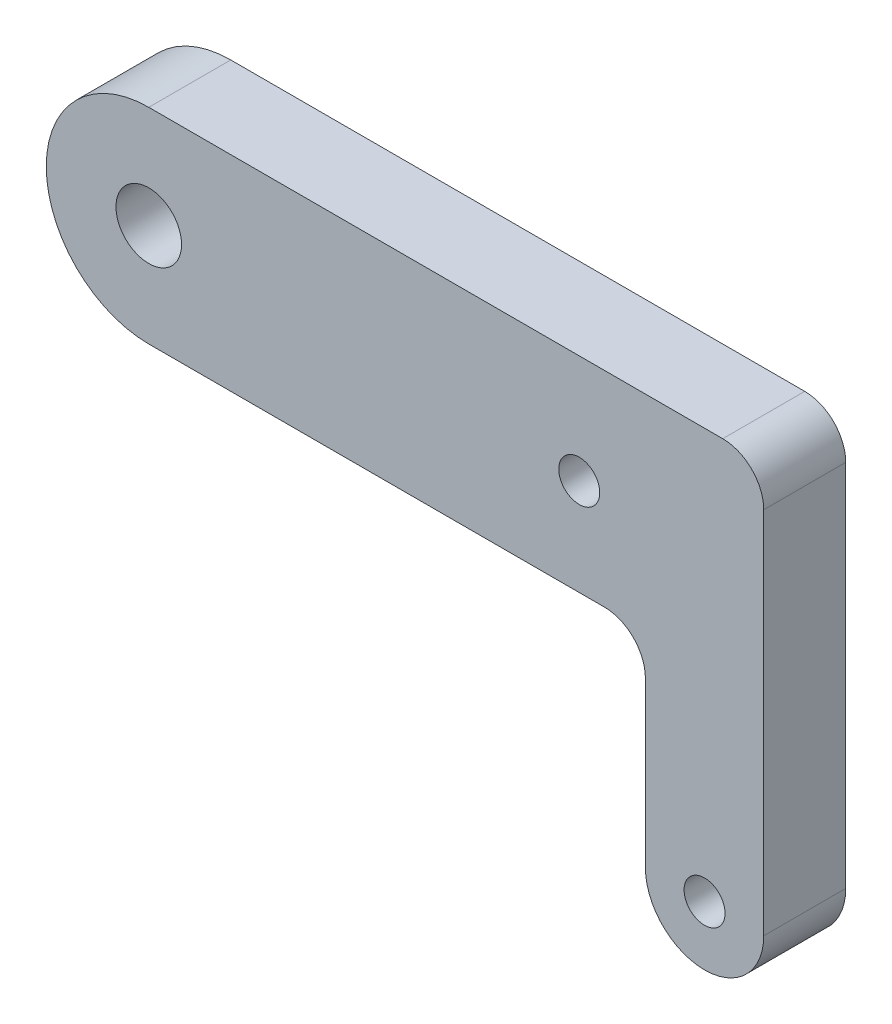
ISO-10303-21;
HEADER;
FILE_DESCRIPTION(('STEP AP214'),'2;1');
FILE_NAME('part.step','',(''),(''),'','','');
FILE_SCHEMA(('AUTOMOTIVE_DESIGN { 1 0 10303 214 1 1 1 1 }'));
ENDSEC;
DATA;
#1=APPLICATION_CONTEXT('core data for automotive mechanical design processes');
#2=APPLICATION_PROTOCOL_DEFINITION('international standard','automotive_design',2000,#1);
#3=PRODUCT_CONTEXT('',#1,'mechanical');
#4=PRODUCT('Part','Part','',(#3));
#5=PRODUCT_RELATED_PRODUCT_CATEGORY('part','',(#4));
#6=PRODUCT_DEFINITION_FORMATION('','',#4);
#7=PRODUCT_DEFINITION_CONTEXT('part definition',#1,'design');
#8=PRODUCT_DEFINITION('design','',#6,#7);
#9=PRODUCT_DEFINITION_SHAPE('','',#8);
#10=(LENGTH_UNIT() NAMED_UNIT(*) SI_UNIT(.MILLI.,.METRE.));
#11=(NAMED_UNIT(*) PLANE_ANGLE_UNIT() SI_UNIT($,.RADIAN.));
#12=(NAMED_UNIT(*) SI_UNIT($,.STERADIAN.) SOLID_ANGLE_UNIT());
#13=UNCERTAINTY_MEASURE_WITH_UNIT(LENGTH_MEASURE(1.E-05),#10,'distance_accuracy_value','');
#14=(GEOMETRIC_REPRESENTATION_CONTEXT(3) GLOBAL_UNCERTAINTY_ASSIGNED_CONTEXT((#13)) GLOBAL_UNIT_ASSIGNED_CONTEXT((#10,
#11,#12)) REPRESENTATION_CONTEXT('',''));
#15=CARTESIAN_POINT('',(0.,0.,0.));
#16=DIRECTION('',(0.,0.,1.));
#17=DIRECTION('',(1.,0.,0.));
#18=AXIS2_PLACEMENT_3D('',#15,#16,#17);
#19=CARTESIAN_POINT('',(-150.,-25.,20.));
#20=DIRECTION('',(0.,0.,1.));
#21=DIRECTION('',(1.,0.,0.));
#22=AXIS2_PLACEMENT_3D('',#19,#20,#21);
#23=PLANE('',#22);
#24=CARTESIAN_POINT('',(-44.9999999999996,-26.4067715761744,20.));
#25=DIRECTION('',(0.,0.,1.));
#26=DIRECTION('',(1.,0.,0.));
#27=AXIS2_PLACEMENT_3D('',#24,#25,#26);
#28=CIRCLE('',#27,5.);
#29=CARTESIAN_POINT('',(-39.9999999999996,-26.4067715761744,20.));
#30=VERTEX_POINT('',#29);
#31=EDGE_CURVE('E203',#30,#30,#28,.T.);
#32=ORIENTED_EDGE('',*,*,#31,.F.);
#33=EDGE_LOOP('',(#32));
#34=FACE_BOUND('',#33,.T.);
#35=CARTESIAN_POINT('',(-150.,-25.,20.));
#36=DIRECTION('',(0.,0.,1.));
#37=DIRECTION('',(1.,0.,0.));
#38=AXIS2_PLACEMENT_3D('',#35,#36,#37);
#39=CIRCLE('',#38,8.00000000000001);
#40=CARTESIAN_POINT('',(-142.,-25.,20.));
#41=VERTEX_POINT('',#40);
#42=EDGE_CURVE('E146',#41,#41,#39,.T.);
#43=ORIENTED_EDGE('',*,*,#42,.F.);
#44=EDGE_LOOP('',(#43));
#45=FACE_BOUND('',#44,.T.);
#46=CARTESIAN_POINT('',(-150.,-25.,20.));
#47=DIRECTION('',(0.,0.,1.));
#48=DIRECTION('',(1.,0.,0.));
#49=AXIS2_PLACEMENT_3D('',#46,#47,#48);
#50=CIRCLE('',#49,25.);
#51=CARTESIAN_POINT('',(-150.,0.,20.));
#52=VERTEX_POINT('',#51);
#53=CARTESIAN_POINT('',(-150.,-50.,20.));
#54=VERTEX_POINT('',#53);
#55=EDGE_CURVE('E157',#52,#54,#50,.T.);
#56=ORIENTED_EDGE('',*,*,#55,.T.);
#57=DIRECTION('',(1.,0.,0.));
#58=VECTOR('',#57,1.);
#59=CARTESIAN_POINT('',(-38.8675134594811,-50.,20.));
#60=LINE('',#59,#58);
#61=CARTESIAN_POINT('',(-38.8675134594811,-50.,20.));
#62=VERTEX_POINT('',#61);
#63=EDGE_CURVE('E105',#54,#62,#60,.T.);
#64=ORIENTED_EDGE('',*,*,#63,.T.);
#65=CARTESIAN_POINT('',(-38.8675134594811,-60.,20.));
#66=DIRECTION('',(0.,0.,-1.));
#67=DIRECTION('',(-1.,0.,0.));
#68=AXIS2_PLACEMENT_3D('',#65,#66,#67);
#69=CIRCLE('',#68,10.);
#70=CARTESIAN_POINT('',(-28.8675134594811,-60.,20.));
#71=VERTEX_POINT('',#70);
#72=EDGE_CURVE('E173',#62,#71,#69,.T.);
#73=ORIENTED_EDGE('',*,*,#72,.T.);
#74=DIRECTION('',(0.,-1.,0.));
#75=VECTOR('',#74,1.);
#76=CARTESIAN_POINT('',(-28.8675134594811,-60.,20.));
#77=LINE('',#76,#75);
#78=CARTESIAN_POINT('',(-28.867513459481,-100.,20.));
#79=VERTEX_POINT('',#78);
#80=EDGE_CURVE('E186',#71,#79,#77,.T.);
#81=ORIENTED_EDGE('',*,*,#80,.T.);
#82=CARTESIAN_POINT('',(-14.4337567297403,-99.9999999999999,20.));
#83=DIRECTION('',(0.,0.,1.));
#84=DIRECTION('',(1.,0.,0.));
#85=AXIS2_PLACEMENT_3D('',#82,#83,#84);
#86=CIRCLE('',#85,14.4337567297407);
#87=CARTESIAN_POINT('',(3.85108611666851E-13,-99.9999999999999,20.));
#88=VERTEX_POINT('',#87);
#89=EDGE_CURVE('E124',#79,#88,#86,.T.);
#90=ORIENTED_EDGE('',*,*,#89,.T.);
#91=DIRECTION('',(0.,1.,0.));
#92=VECTOR('',#91,1.);
#93=CARTESIAN_POINT('',(0.,-9.99999999999996,20.));
#94=LINE('',#93,#92);
#95=CARTESIAN_POINT('',(0.,-9.99999999999996,20.));
#96=VERTEX_POINT('',#95);
#97=EDGE_CURVE('E118',#88,#96,#94,.T.);
#98=ORIENTED_EDGE('',*,*,#97,.T.);
#99=CARTESIAN_POINT('',(-9.99999999999996,-10.,20.));
#100=DIRECTION('',(0.,0.,1.));
#101=DIRECTION('',(-1.,0.,0.));
#102=AXIS2_PLACEMENT_3D('',#99,#100,#101);
#103=CIRCLE('',#102,10.);
#104=CARTESIAN_POINT('',(-9.99999999999996,0.,20.));
#105=VERTEX_POINT('',#104);
#106=EDGE_CURVE('E122',#96,#105,#103,.T.);
#107=ORIENTED_EDGE('',*,*,#106,.T.);
#108=DIRECTION('',(-1.,0.,0.));
#109=VECTOR('',#108,1.);
#110=CARTESIAN_POINT('',(-9.99999999999996,0.,20.));
#111=LINE('',#110,#109);
#112=EDGE_CURVE('E62',#105,#52,#111,.T.);
#113=ORIENTED_EDGE('',*,*,#112,.T.);
#114=EDGE_LOOP('',(#56,#64,#73,#81,#90,#98,#107,#113));
#115=FACE_BOUND('',#114,.T.);
#116=CARTESIAN_POINT('',(-14.4337567297403,-99.9999999999999,20.));
#117=DIRECTION('',(0.,0.,1.));
#118=DIRECTION('',(1.,0.,0.));
#119=AXIS2_PLACEMENT_3D('',#116,#117,#118);
#120=CIRCLE('',#119,5.00000000000001);
#121=CARTESIAN_POINT('',(-9.43375672974029,-99.9999999999999,20.));
#122=VERTEX_POINT('',#121);
#123=EDGE_CURVE('E195',#122,#122,#120,.T.);
#124=ORIENTED_EDGE('',*,*,#123,.F.);
#125=EDGE_LOOP('',(#124));
#126=FACE_BOUND('',#125,.T.);
#127=ADVANCED_FACE('F44',(#34,#45,#115,#126),#23,.T.);
#128=CARTESIAN_POINT('',(-150.,-25.,0.));
#129=DIRECTION('',(0.,0.,1.));
#130=DIRECTION('',(1.,0.,0.));
#131=AXIS2_PLACEMENT_3D('',#128,#129,#130);
#132=PLANE('',#131);
#133=CARTESIAN_POINT('',(-44.9999999999996,-26.4067715761744,0.));
#134=DIRECTION('',(0.,0.,1.));
#135=DIRECTION('',(1.,0.,0.));
#136=AXIS2_PLACEMENT_3D('',#133,#134,#135);
#137=CIRCLE('',#136,5.);
#138=CARTESIAN_POINT('',(-39.9999999999996,-26.4067715761744,0.));
#139=VERTEX_POINT('',#138);
#140=EDGE_CURVE('E48',#139,#139,#137,.T.);
#141=ORIENTED_EDGE('',*,*,#140,.T.);
#142=EDGE_LOOP('',(#141));
#143=FACE_BOUND('',#142,.T.);
#144=CARTESIAN_POINT('',(-150.,-25.,0.));
#145=DIRECTION('',(0.,0.,1.));
#146=DIRECTION('',(1.,0.,0.));
#147=AXIS2_PLACEMENT_3D('',#144,#145,#146);
#148=CIRCLE('',#147,25.);
#149=CARTESIAN_POINT('',(-150.,0.,0.));
#150=VERTEX_POINT('',#149);
#151=CARTESIAN_POINT('',(-150.,-50.,0.));
#152=VERTEX_POINT('',#151);
#153=EDGE_CURVE('E142',#150,#152,#148,.T.);
#154=ORIENTED_EDGE('',*,*,#153,.F.);
#155=DIRECTION('',(-1.,0.,0.));
#156=VECTOR('',#155,1.);
#157=CARTESIAN_POINT('',(-9.99999999999996,0.,0.));
#158=LINE('',#157,#156);
#159=CARTESIAN_POINT('',(-9.99999999999996,0.,0.));
#160=VERTEX_POINT('',#159);
#161=EDGE_CURVE('E97',#160,#150,#158,.T.);
#162=ORIENTED_EDGE('',*,*,#161,.F.);
#163=CARTESIAN_POINT('',(-9.99999999999996,-10.,0.));
#164=DIRECTION('',(0.,0.,1.));
#165=DIRECTION('',(-1.,0.,0.));
#166=AXIS2_PLACEMENT_3D('',#163,#164,#165);
#167=CIRCLE('',#166,10.);
#168=CARTESIAN_POINT('',(0.,-9.99999999999996,0.));
#169=VERTEX_POINT('',#168);
#170=EDGE_CURVE('E91',#169,#160,#167,.T.);
#171=ORIENTED_EDGE('',*,*,#170,.F.);
#172=DIRECTION('',(0.,1.,0.));
#173=VECTOR('',#172,1.);
#174=CARTESIAN_POINT('',(0.,-9.99999999999996,0.));
#175=LINE('',#174,#173);
#176=CARTESIAN_POINT('',(3.85108611666851E-13,-99.9999999999999,0.));
#177=VERTEX_POINT('',#176);
#178=EDGE_CURVE('E132',#177,#169,#175,.T.);
#179=ORIENTED_EDGE('',*,*,#178,.F.);
#180=CARTESIAN_POINT('',(-14.4337567297403,-99.9999999999999,0.));
#181=DIRECTION('',(0.,0.,1.));
#182=DIRECTION('',(1.,0.,0.));
#183=AXIS2_PLACEMENT_3D('',#180,#181,#182);
#184=CIRCLE('',#183,14.4337567297407);
#185=CARTESIAN_POINT('',(-28.867513459481,-100.,0.));
#186=VERTEX_POINT('',#185);
#187=EDGE_CURVE('E152',#186,#177,#184,.T.);
#188=ORIENTED_EDGE('',*,*,#187,.F.);
#189=DIRECTION('',(0.,-1.,0.));
#190=VECTOR('',#189,1.);
#191=CARTESIAN_POINT('',(-28.8675134594811,-60.,0.));
#192=LINE('',#191,#190);
#193=CARTESIAN_POINT('',(-28.8675134594811,-60.,0.));
#194=VERTEX_POINT('',#193);
#195=EDGE_CURVE('E150',#194,#186,#192,.T.);
#196=ORIENTED_EDGE('',*,*,#195,.F.);
#197=CARTESIAN_POINT('',(-38.8675134594811,-60.,0.));
#198=DIRECTION('',(0.,0.,-1.));
#199=DIRECTION('',(-1.,0.,0.));
#200=AXIS2_PLACEMENT_3D('',#197,#198,#199);
#201=CIRCLE('',#200,10.);
#202=CARTESIAN_POINT('',(-38.8675134594811,-50.,0.));
#203=VERTEX_POINT('',#202);
#204=EDGE_CURVE('E148',#203,#194,#201,.T.);
#205=ORIENTED_EDGE('',*,*,#204,.F.);
#206=DIRECTION('',(1.,0.,0.));
#207=VECTOR('',#206,1.);
#208=CARTESIAN_POINT('',(-38.8675134594811,-50.,0.));
#209=LINE('',#208,#207);
#210=EDGE_CURVE('E145',#152,#203,#209,.T.);
#211=ORIENTED_EDGE('',*,*,#210,.F.);
#212=EDGE_LOOP('',(#154,#162,#171,#179,#188,#196,#205,#211));
#213=FACE_BOUND('',#212,.T.);
#214=CARTESIAN_POINT('',(-150.,-25.,0.));
#215=DIRECTION('',(0.,0.,1.));
#216=DIRECTION('',(1.,0.,0.));
#217=AXIS2_PLACEMENT_3D('',#214,#215,#216);
#218=CIRCLE('',#217,8.00000000000001);
#219=CARTESIAN_POINT('',(-142.,-25.,0.));
#220=VERTEX_POINT('',#219);
#221=EDGE_CURVE('E192',#220,#220,#218,.T.);
#222=ORIENTED_EDGE('',*,*,#221,.T.);
#223=EDGE_LOOP('',(#222));
#224=FACE_BOUND('',#223,.T.);
#225=CARTESIAN_POINT('',(-14.4337567297403,-99.9999999999999,0.));
#226=DIRECTION('',(0.,0.,1.));
#227=DIRECTION('',(1.,0.,0.));
#228=AXIS2_PLACEMENT_3D('',#225,#226,#227);
#229=CIRCLE('',#228,5.00000000000001);
#230=CARTESIAN_POINT('',(-9.43375672974029,-99.9999999999999,0.));
#231=VERTEX_POINT('',#230);
#232=EDGE_CURVE('E198',#231,#231,#229,.T.);
#233=ORIENTED_EDGE('',*,*,#232,.T.);
#234=EDGE_LOOP('',(#233));
#235=FACE_BOUND('',#234,.T.);
#236=ADVANCED_FACE('F177',(#143,#213,#224,#235),#132,.F.);
#237=CARTESIAN_POINT('',(-150.,-25.,20.));
#238=DIRECTION('',(0.,0.,-1.));
#239=DIRECTION('',(-1.,0.,0.));
#240=AXIS2_PLACEMENT_3D('',#237,#238,#239);
#241=CYLINDRICAL_SURFACE('',#240,25.);
#242=ORIENTED_EDGE('',*,*,#153,.T.);
#243=DIRECTION('',(0.,0.,-1.));
#244=VECTOR('',#243,1.);
#245=CARTESIAN_POINT('',(-150.,-50.,20.));
#246=LINE('',#245,#244);
#247=EDGE_CURVE('E13',#54,#152,#246,.T.);
#248=ORIENTED_EDGE('',*,*,#247,.F.);
#249=ORIENTED_EDGE('',*,*,#55,.F.);
#250=DIRECTION('',(0.,0.,-1.));
#251=VECTOR('',#250,1.);
#252=CARTESIAN_POINT('',(-150.,0.,20.));
#253=LINE('',#252,#251);
#254=EDGE_CURVE('E138',#52,#150,#253,.T.);
#255=ORIENTED_EDGE('',*,*,#254,.T.);
#256=EDGE_LOOP('',(#242,#248,#249,#255));
#257=FACE_BOUND('',#256,.T.);
#258=ADVANCED_FACE('F46',(#257),#241,.T.);
#259=CARTESIAN_POINT('',(-38.8675134594811,-50.,20.));
#260=DIRECTION('',(0.,1.,0.));
#261=DIRECTION('',(-1.,0.,0.));
#262=AXIS2_PLACEMENT_3D('',#259,#260,#261);
#263=PLANE('',#262);
#264=ORIENTED_EDGE('',*,*,#210,.T.);
#265=DIRECTION('',(0.,0.,-1.));
#266=VECTOR('',#265,1.);
#267=CARTESIAN_POINT('',(-38.8675134594811,-50.,20.));
#268=LINE('',#267,#266);
#269=EDGE_CURVE('E54',#62,#203,#268,.T.);
#270=ORIENTED_EDGE('',*,*,#269,.F.);
#271=ORIENTED_EDGE('',*,*,#63,.F.);
#272=ORIENTED_EDGE('',*,*,#247,.T.);
#273=EDGE_LOOP('',(#264,#270,#271,#272));
#274=FACE_BOUND('',#273,.T.);
#275=ADVANCED_FACE('F243',(#274),#263,.F.);
#276=CARTESIAN_POINT('',(-38.8675134594811,-60.,20.));
#277=DIRECTION('',(0.,0.,-1.));
#278=DIRECTION('',(-1.,0.,0.));
#279=AXIS2_PLACEMENT_3D('',#276,#277,#278);
#280=CYLINDRICAL_SURFACE('',#279,10.);
#281=ORIENTED_EDGE('',*,*,#204,.T.);
#282=DIRECTION('',(0.,0.,-1.));
#283=VECTOR('',#282,1.);
#284=CARTESIAN_POINT('',(-28.8675134594811,-60.,20.));
#285=LINE('',#284,#283);
#286=EDGE_CURVE('E164',#71,#194,#285,.T.);
#287=ORIENTED_EDGE('',*,*,#286,.F.);
#288=ORIENTED_EDGE('',*,*,#72,.F.);
#289=ORIENTED_EDGE('',*,*,#269,.T.);
#290=EDGE_LOOP('',(#281,#287,#288,#289));
#291=FACE_BOUND('',#290,.T.);
#292=ADVANCED_FACE('F171',(#291),#280,.F.);
#293=CARTESIAN_POINT('',(-28.8675134594811,-60.,20.));
#294=DIRECTION('',(1.,0.,0.));
#295=DIRECTION('',(0.,1.,0.));
#296=AXIS2_PLACEMENT_3D('',#293,#294,#295);
#297=PLANE('',#296);
#298=ORIENTED_EDGE('',*,*,#195,.T.);
#299=DIRECTION('',(0.,0.,-1.));
#300=VECTOR('',#299,1.);
#301=CARTESIAN_POINT('',(-28.867513459481,-100.,20.));
#302=LINE('',#301,#300);
#303=EDGE_CURVE('E161',#79,#186,#302,.T.);
#304=ORIENTED_EDGE('',*,*,#303,.F.);
#305=ORIENTED_EDGE('',*,*,#80,.F.);
#306=ORIENTED_EDGE('',*,*,#286,.T.);
#307=EDGE_LOOP('',(#298,#304,#305,#306));
#308=FACE_BOUND('',#307,.T.);
#309=ADVANCED_FACE('F182',(#308),#297,.F.);
#310=CARTESIAN_POINT('',(-14.4337567297403,-99.9999999999999,20.));
#311=DIRECTION('',(0.,0.,-1.));
#312=DIRECTION('',(-1.,0.,0.));
#313=AXIS2_PLACEMENT_3D('',#310,#311,#312);
#314=CYLINDRICAL_SURFACE('',#313,14.4337567297407);
#315=ORIENTED_EDGE('',*,*,#187,.T.);
#316=DIRECTION('',(0.,0.,-1.));
#317=VECTOR('',#316,1.);
#318=CARTESIAN_POINT('',(3.85108611666851E-13,-99.9999999999999,20.));
#319=LINE('',#318,#317);
#320=EDGE_CURVE('E133',#88,#177,#319,.T.);
#321=ORIENTED_EDGE('',*,*,#320,.F.);
#322=ORIENTED_EDGE('',*,*,#89,.F.);
#323=ORIENTED_EDGE('',*,*,#303,.T.);
#324=EDGE_LOOP('',(#315,#321,#322,#323));
#325=FACE_BOUND('',#324,.T.);
#326=ADVANCED_FACE('F185',(#325),#314,.T.);
#327=CARTESIAN_POINT('',(0.,-9.99999999999996,20.));
#328=DIRECTION('',(-1.,0.,0.));
#329=DIRECTION('',(0.,-1.,0.));
#330=AXIS2_PLACEMENT_3D('',#327,#328,#329);
#331=PLANE('',#330);
#332=ORIENTED_EDGE('',*,*,#178,.T.);
#333=DIRECTION('',(0.,0.,-1.));
#334=VECTOR('',#333,1.);
#335=CARTESIAN_POINT('',(0.,-9.99999999999996,20.));
#336=LINE('',#335,#334);
#337=EDGE_CURVE('E129',#96,#169,#336,.T.);
#338=ORIENTED_EDGE('',*,*,#337,.F.);
#339=ORIENTED_EDGE('',*,*,#97,.F.);
#340=ORIENTED_EDGE('',*,*,#320,.T.);
#341=EDGE_LOOP('',(#332,#338,#339,#340));
#342=FACE_BOUND('',#341,.T.);
#343=ADVANCED_FACE('F130',(#342),#331,.F.);
#344=CARTESIAN_POINT('',(-9.99999999999996,-10.,20.));
#345=DIRECTION('',(0.,0.,-1.));
#346=DIRECTION('',(-1.,0.,0.));
#347=AXIS2_PLACEMENT_3D('',#344,#345,#346);
#348=CYLINDRICAL_SURFACE('',#347,10.);
#349=ORIENTED_EDGE('',*,*,#170,.T.);
#350=DIRECTION('',(0.,0.,-1.));
#351=VECTOR('',#350,1.);
#352=CARTESIAN_POINT('',(-9.99999999999996,0.,20.));
#353=LINE('',#352,#351);
#354=EDGE_CURVE('E134',#105,#160,#353,.T.);
#355=ORIENTED_EDGE('',*,*,#354,.F.);
#356=ORIENTED_EDGE('',*,*,#106,.F.);
#357=ORIENTED_EDGE('',*,*,#337,.T.);
#358=EDGE_LOOP('',(#349,#355,#356,#357));
#359=FACE_BOUND('',#358,.T.);
#360=ADVANCED_FACE('F136',(#359),#348,.T.);
#361=CARTESIAN_POINT('',(-9.99999999999996,0.,20.));
#362=DIRECTION('',(0.,-1.,0.));
#363=DIRECTION('',(1.,0.,0.));
#364=AXIS2_PLACEMENT_3D('',#361,#362,#363);
#365=PLANE('',#364);
#366=ORIENTED_EDGE('',*,*,#161,.T.);
#367=ORIENTED_EDGE('',*,*,#254,.F.);
#368=ORIENTED_EDGE('',*,*,#112,.F.);
#369=ORIENTED_EDGE('',*,*,#354,.T.);
#370=EDGE_LOOP('',(#366,#367,#368,#369));
#371=FACE_BOUND('',#370,.T.);
#372=ADVANCED_FACE('F231',(#371),#365,.F.);
#373=CARTESIAN_POINT('',(-150.,-25.,20.));
#374=DIRECTION('',(0.,0.,-1.));
#375=DIRECTION('',(-1.,0.,0.));
#376=AXIS2_PLACEMENT_3D('',#373,#374,#375);
#377=CYLINDRICAL_SURFACE('',#376,8.00000000000001);
#378=ORIENTED_EDGE('',*,*,#42,.T.);
#379=EDGE_LOOP('',(#378));
#380=FACE_BOUND('',#379,.T.);
#381=ORIENTED_EDGE('',*,*,#221,.F.);
#382=EDGE_LOOP('',(#381));
#383=FACE_BOUND('',#382,.T.);
#384=ADVANCED_FACE('F218',(#380,#383),#377,.F.);
#385=CARTESIAN_POINT('',(-14.4337567297403,-99.9999999999999,20.));
#386=DIRECTION('',(0.,0.,-1.));
#387=DIRECTION('',(-1.,0.,0.));
#388=AXIS2_PLACEMENT_3D('',#385,#386,#387);
#389=CYLINDRICAL_SURFACE('',#388,5.00000000000001);
#390=ORIENTED_EDGE('',*,*,#123,.T.);
#391=EDGE_LOOP('',(#390));
#392=FACE_BOUND('',#391,.T.);
#393=ORIENTED_EDGE('',*,*,#232,.F.);
#394=EDGE_LOOP('',(#393));
#395=FACE_BOUND('',#394,.T.);
#396=ADVANCED_FACE('F213',(#392,#395),#389,.F.);
#397=CARTESIAN_POINT('',(-44.9999999999996,-26.4067715761744,-15.));
#398=DIRECTION('',(0.,0.,1.));
#399=DIRECTION('',(1.,0.,0.));
#400=AXIS2_PLACEMENT_3D('',#397,#398,#399);
#401=CYLINDRICAL_SURFACE('',#400,5.);
#402=ORIENTED_EDGE('',*,*,#31,.T.);
#403=EDGE_LOOP('',(#402));
#404=FACE_BOUND('',#403,.T.);
#405=ORIENTED_EDGE('',*,*,#140,.F.);
#406=EDGE_LOOP('',(#405));
#407=FACE_BOUND('',#406,.T.);
#408=ADVANCED_FACE('F211',(#404,#407),#401,.F.);
#409=CLOSED_SHELL('',(#127,#236,#258,#275,#292,#309,#326,#343,#360,#372,#384,#396,#408));
#410=MANIFOLD_SOLID_BREP('B2',#409);
#411=ADVANCED_BREP_SHAPE_REPRESENTATION('',(#18,#410),#14);
#412=SHAPE_DEFINITION_REPRESENTATION(#9,#411);
ENDSEC;
END-ISO-10303-21;
